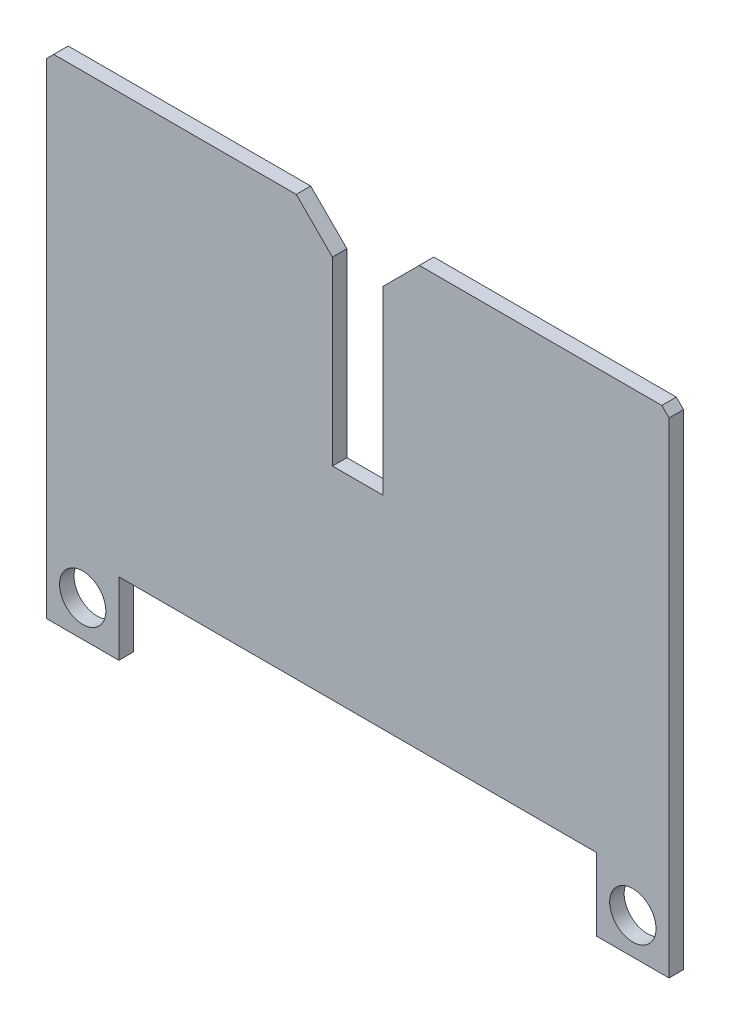
ISO-10303-21;
HEADER;
FILE_DESCRIPTION(('STEP AP214'),'2;1');
FILE_NAME('part.step','',(''),(''),'','','');
FILE_SCHEMA(('AUTOMOTIVE_DESIGN { 1 0 10303 214 1 1 1 1 }'));
ENDSEC;
DATA;
#1=APPLICATION_CONTEXT('core data for automotive mechanical design processes');
#2=APPLICATION_PROTOCOL_DEFINITION('international standard','automotive_design',2000,#1);
#3=PRODUCT_CONTEXT('',#1,'mechanical');
#4=PRODUCT('Part','Part','',(#3));
#5=PRODUCT_RELATED_PRODUCT_CATEGORY('part','',(#4));
#6=PRODUCT_DEFINITION_FORMATION('','',#4);
#7=PRODUCT_DEFINITION_CONTEXT('part definition',#1,'design');
#8=PRODUCT_DEFINITION('design','',#6,#7);
#9=PRODUCT_DEFINITION_SHAPE('','',#8);
#10=(LENGTH_UNIT() NAMED_UNIT(*) SI_UNIT(.MILLI.,.METRE.));
#11=(NAMED_UNIT(*) PLANE_ANGLE_UNIT() SI_UNIT($,.RADIAN.));
#12=(NAMED_UNIT(*) SI_UNIT($,.STERADIAN.) SOLID_ANGLE_UNIT());
#13=UNCERTAINTY_MEASURE_WITH_UNIT(LENGTH_MEASURE(1.E-05),#10,'distance_accuracy_value','');
#14=(GEOMETRIC_REPRESENTATION_CONTEXT(3) GLOBAL_UNCERTAINTY_ASSIGNED_CONTEXT((#13)) GLOBAL_UNIT_ASSIGNED_CONTEXT((#10,
#11,#12)) REPRESENTATION_CONTEXT('',''));
#15=CARTESIAN_POINT('',(0.,0.,0.));
#16=DIRECTION('',(0.,0.,1.));
#17=DIRECTION('',(1.,0.,0.));
#18=AXIS2_PLACEMENT_3D('',#15,#16,#17);
#19=CARTESIAN_POINT('',(-21.5,0.,1.));
#20=DIRECTION('',(-1.,0.,0.));
#21=DIRECTION('',(0.,-1.,0.));
#22=AXIS2_PLACEMENT_3D('',#19,#20,#21);
#23=PLANE('',#22);
#24=DIRECTION('',(0.,1.,0.));
#25=VECTOR('',#24,1.);
#26=CARTESIAN_POINT('',(-21.5,0.,0.));
#27=LINE('',#26,#25);
#28=CARTESIAN_POINT('',(-21.5,-26.475,0.));
#29=VERTEX_POINT('',#28);
#30=CARTESIAN_POINT('',(-21.5,7.025,0.));
#31=VERTEX_POINT('',#30);
#32=EDGE_CURVE('E184',#29,#31,#27,.T.);
#33=ORIENTED_EDGE('',*,*,#32,.F.);
#34=DIRECTION('',(0.,0.,-1.));
#35=VECTOR('',#34,1.);
#36=CARTESIAN_POINT('',(-21.5,-26.475,1.));
#37=LINE('',#36,#35);
#38=CARTESIAN_POINT('',(-21.5,-26.475,1.));
#39=VERTEX_POINT('',#38);
#40=EDGE_CURVE('E11',#39,#29,#37,.T.);
#41=ORIENTED_EDGE('',*,*,#40,.F.);
#42=DIRECTION('',(0.,1.,0.));
#43=VECTOR('',#42,1.);
#44=CARTESIAN_POINT('',(-21.5,0.,1.));
#45=LINE('',#44,#43);
#46=CARTESIAN_POINT('',(-21.5,7.025,1.));
#47=VERTEX_POINT('',#46);
#48=EDGE_CURVE('E232',#39,#47,#45,.T.);
#49=ORIENTED_EDGE('',*,*,#48,.T.);
#50=DIRECTION('',(0.,0.,-1.));
#51=VECTOR('',#50,1.);
#52=CARTESIAN_POINT('',(-21.5,7.025,1.));
#53=LINE('',#52,#51);
#54=EDGE_CURVE('E51',#47,#31,#53,.T.);
#55=ORIENTED_EDGE('',*,*,#54,.T.);
#56=EDGE_LOOP('',(#33,#41,#49,#55));
#57=FACE_BOUND('',#56,.T.);
#58=ADVANCED_FACE('F35',(#57),#23,.T.);
#59=CARTESIAN_POINT('',(0.,-26.475,1.));
#60=DIRECTION('',(0.,1.,0.));
#61=DIRECTION('',(0.,0.,1.));
#62=AXIS2_PLACEMENT_3D('',#59,#60,#61);
#63=PLANE('',#62);
#64=DIRECTION('',(1.,0.,0.));
#65=VECTOR('',#64,1.);
#66=CARTESIAN_POINT('',(0.,-26.475,0.));
#67=LINE('',#66,#65);
#68=CARTESIAN_POINT('',(-16.5,-26.475,0.));
#69=VERTEX_POINT('',#68);
#70=EDGE_CURVE('E186',#29,#69,#67,.T.);
#71=ORIENTED_EDGE('',*,*,#70,.T.);
#72=DIRECTION('',(0.,0.,-1.));
#73=VECTOR('',#72,1.);
#74=CARTESIAN_POINT('',(-16.5,-26.475,1.));
#75=LINE('',#74,#73);
#76=CARTESIAN_POINT('',(-16.5,-26.475,1.));
#77=VERTEX_POINT('',#76);
#78=EDGE_CURVE('E43',#77,#69,#75,.T.);
#79=ORIENTED_EDGE('',*,*,#78,.F.);
#80=DIRECTION('',(1.,0.,0.));
#81=VECTOR('',#80,1.);
#82=CARTESIAN_POINT('',(0.,-26.475,1.));
#83=LINE('',#82,#81);
#84=EDGE_CURVE('E282',#39,#77,#83,.T.);
#85=ORIENTED_EDGE('',*,*,#84,.F.);
#86=ORIENTED_EDGE('',*,*,#40,.T.);
#87=EDGE_LOOP('',(#71,#79,#85,#86));
#88=FACE_BOUND('',#87,.T.);
#89=ADVANCED_FACE('F322',(#88),#63,.F.);
#90=CARTESIAN_POINT('',(-16.5,0.,1.));
#91=DIRECTION('',(-1.,0.,0.));
#92=DIRECTION('',(0.,0.,1.));
#93=AXIS2_PLACEMENT_3D('',#90,#91,#92);
#94=PLANE('',#93);
#95=DIRECTION('',(0.,1.,0.));
#96=VECTOR('',#95,1.);
#97=CARTESIAN_POINT('',(-16.5,0.,0.));
#98=LINE('',#97,#96);
#99=CARTESIAN_POINT('',(-16.5,-21.475,0.));
#100=VERTEX_POINT('',#99);
#101=EDGE_CURVE('E188',#69,#100,#98,.T.);
#102=ORIENTED_EDGE('',*,*,#101,.T.);
#103=DIRECTION('',(0.,0.,-1.));
#104=VECTOR('',#103,1.);
#105=CARTESIAN_POINT('',(-16.5,-21.475,1.));
#106=LINE('',#105,#104);
#107=CARTESIAN_POINT('',(-16.5,-21.475,1.));
#108=VERTEX_POINT('',#107);
#109=EDGE_CURVE('E254',#108,#100,#106,.T.);
#110=ORIENTED_EDGE('',*,*,#109,.F.);
#111=DIRECTION('',(0.,1.,0.));
#112=VECTOR('',#111,1.);
#113=CARTESIAN_POINT('',(-16.5,0.,1.));
#114=LINE('',#113,#112);
#115=EDGE_CURVE('E263',#77,#108,#114,.T.);
#116=ORIENTED_EDGE('',*,*,#115,.F.);
#117=ORIENTED_EDGE('',*,*,#78,.T.);
#118=EDGE_LOOP('',(#102,#110,#116,#117));
#119=FACE_BOUND('',#118,.T.);
#120=ADVANCED_FACE('F261',(#119),#94,.F.);
#121=CARTESIAN_POINT('',(0.,-21.475,1.));
#122=DIRECTION('',(0.,1.,0.));
#123=DIRECTION('',(-1.,0.,0.));
#124=AXIS2_PLACEMENT_3D('',#121,#122,#123);
#125=PLANE('',#124);
#126=DIRECTION('',(1.,0.,0.));
#127=VECTOR('',#126,1.);
#128=CARTESIAN_POINT('',(0.,-21.475,0.));
#129=LINE('',#128,#127);
#130=CARTESIAN_POINT('',(16.5,-21.475,0.));
#131=VERTEX_POINT('',#130);
#132=EDGE_CURVE('E190',#100,#131,#129,.T.);
#133=ORIENTED_EDGE('',*,*,#132,.T.);
#134=DIRECTION('',(0.,0.,-1.));
#135=VECTOR('',#134,1.);
#136=CARTESIAN_POINT('',(16.5,-21.475,1.));
#137=LINE('',#136,#135);
#138=CARTESIAN_POINT('',(16.5,-21.475,1.));
#139=VERTEX_POINT('',#138);
#140=EDGE_CURVE('E252',#139,#131,#137,.T.);
#141=ORIENTED_EDGE('',*,*,#140,.F.);
#142=DIRECTION('',(1.,0.,0.));
#143=VECTOR('',#142,1.);
#144=CARTESIAN_POINT('',(0.,-21.475,1.));
#145=LINE('',#144,#143);
#146=EDGE_CURVE('E276',#108,#139,#145,.T.);
#147=ORIENTED_EDGE('',*,*,#146,.F.);
#148=ORIENTED_EDGE('',*,*,#109,.T.);
#149=EDGE_LOOP('',(#133,#141,#147,#148));
#150=FACE_BOUND('',#149,.T.);
#151=ADVANCED_FACE('F273',(#150),#125,.F.);
#152=CARTESIAN_POINT('',(16.5,0.,1.));
#153=DIRECTION('',(-1.,0.,0.));
#154=DIRECTION('',(0.,0.,1.));
#155=AXIS2_PLACEMENT_3D('',#152,#153,#154);
#156=PLANE('',#155);
#157=DIRECTION('',(0.,1.,0.));
#158=VECTOR('',#157,1.);
#159=CARTESIAN_POINT('',(16.5,0.,0.));
#160=LINE('',#159,#158);
#161=CARTESIAN_POINT('',(16.5,-26.475,0.));
#162=VERTEX_POINT('',#161);
#163=EDGE_CURVE('E193',#162,#131,#160,.T.);
#164=ORIENTED_EDGE('',*,*,#163,.F.);
#165=DIRECTION('',(0.,0.,-1.));
#166=VECTOR('',#165,1.);
#167=CARTESIAN_POINT('',(16.5,-26.475,1.));
#168=LINE('',#167,#166);
#169=CARTESIAN_POINT('',(16.5,-26.475,1.));
#170=VERTEX_POINT('',#169);
#171=EDGE_CURVE('E250',#170,#162,#168,.T.);
#172=ORIENTED_EDGE('',*,*,#171,.F.);
#173=DIRECTION('',(0.,1.,0.));
#174=VECTOR('',#173,1.);
#175=CARTESIAN_POINT('',(16.5,0.,1.));
#176=LINE('',#175,#174);
#177=EDGE_CURVE('E278',#170,#139,#176,.T.);
#178=ORIENTED_EDGE('',*,*,#177,.T.);
#179=ORIENTED_EDGE('',*,*,#140,.T.);
#180=EDGE_LOOP('',(#164,#172,#178,#179));
#181=FACE_BOUND('',#180,.T.);
#182=ADVANCED_FACE('F333',(#181),#156,.T.);
#183=CARTESIAN_POINT('',(0.,-26.475,1.));
#184=DIRECTION('',(0.,-1.,0.));
#185=DIRECTION('',(0.,0.,-1.));
#186=AXIS2_PLACEMENT_3D('',#183,#184,#185);
#187=PLANE('',#186);
#188=DIRECTION('',(-1.,0.,0.));
#189=VECTOR('',#188,1.);
#190=CARTESIAN_POINT('',(0.,-26.475,0.));
#191=LINE('',#190,#189);
#192=CARTESIAN_POINT('',(21.5,-26.475,0.));
#193=VERTEX_POINT('',#192);
#194=EDGE_CURVE('E196',#193,#162,#191,.T.);
#195=ORIENTED_EDGE('',*,*,#194,.F.);
#196=DIRECTION('',(0.,0.,-1.));
#197=VECTOR('',#196,1.);
#198=CARTESIAN_POINT('',(21.5,-26.475,1.));
#199=LINE('',#198,#197);
#200=CARTESIAN_POINT('',(21.5,-26.475,1.));
#201=VERTEX_POINT('',#200);
#202=EDGE_CURVE('E248',#201,#193,#199,.T.);
#203=ORIENTED_EDGE('',*,*,#202,.F.);
#204=DIRECTION('',(-1.,0.,0.));
#205=VECTOR('',#204,1.);
#206=CARTESIAN_POINT('',(0.,-26.475,1.));
#207=LINE('',#206,#205);
#208=EDGE_CURVE('E280',#201,#170,#207,.T.);
#209=ORIENTED_EDGE('',*,*,#208,.T.);
#210=ORIENTED_EDGE('',*,*,#171,.T.);
#211=EDGE_LOOP('',(#195,#203,#209,#210));
#212=FACE_BOUND('',#211,.T.);
#213=ADVANCED_FACE('F336',(#212),#187,.T.);
#214=CARTESIAN_POINT('',(21.5,0.,1.));
#215=DIRECTION('',(-1.,0.,0.));
#216=DIRECTION('',(0.,0.,1.));
#217=AXIS2_PLACEMENT_3D('',#214,#215,#216);
#218=PLANE('',#217);
#219=DIRECTION('',(0.,1.,0.));
#220=VECTOR('',#219,1.);
#221=CARTESIAN_POINT('',(21.5,0.,0.));
#222=LINE('',#221,#220);
#223=CARTESIAN_POINT('',(21.5,7.025,0.));
#224=VERTEX_POINT('',#223);
#225=EDGE_CURVE('E199',#193,#224,#222,.T.);
#226=ORIENTED_EDGE('',*,*,#225,.T.);
#227=DIRECTION('',(0.,0.,-1.));
#228=VECTOR('',#227,1.);
#229=CARTESIAN_POINT('',(21.5,7.025,1.));
#230=LINE('',#229,#228);
#231=CARTESIAN_POINT('',(21.5,7.025,1.));
#232=VERTEX_POINT('',#231);
#233=EDGE_CURVE('E246',#232,#224,#230,.T.);
#234=ORIENTED_EDGE('',*,*,#233,.F.);
#235=DIRECTION('',(0.,1.,0.));
#236=VECTOR('',#235,1.);
#237=CARTESIAN_POINT('',(21.5,0.,1.));
#238=LINE('',#237,#236);
#239=EDGE_CURVE('E288',#201,#232,#238,.T.);
#240=ORIENTED_EDGE('',*,*,#239,.F.);
#241=ORIENTED_EDGE('',*,*,#202,.T.);
#242=EDGE_LOOP('',(#226,#234,#240,#241));
#243=FACE_BOUND('',#242,.T.);
#244=ADVANCED_FACE('F340',(#243),#218,.F.);
#245=CARTESIAN_POINT('',(14.2624999999997,14.2625000000001,1.));
#246=DIRECTION('',(0.707106781186539,0.707106781186556,0.));
#247=DIRECTION('',(-0.707106781186556,0.707106781186539,0.));
#248=AXIS2_PLACEMENT_3D('',#245,#246,#247);
#249=PLANE('',#248);
#250=DIRECTION('',(0.707106781186556,-0.707106781186539,0.));
#251=VECTOR('',#250,1.);
#252=CARTESIAN_POINT('',(14.2624999999997,14.2625000000001,0.));
#253=LINE('',#252,#251);
#254=CARTESIAN_POINT('',(21.,7.525,0.));
#255=VERTEX_POINT('',#254);
#256=EDGE_CURVE('E202',#255,#224,#253,.T.);
#257=ORIENTED_EDGE('',*,*,#256,.F.);
#258=DIRECTION('',(0.,0.,-1.));
#259=VECTOR('',#258,1.);
#260=CARTESIAN_POINT('',(21.,7.525,1.));
#261=LINE('',#260,#259);
#262=CARTESIAN_POINT('',(21.,7.525,1.));
#263=VERTEX_POINT('',#262);
#264=EDGE_CURVE('E244',#263,#255,#261,.T.);
#265=ORIENTED_EDGE('',*,*,#264,.F.);
#266=DIRECTION('',(0.707106781186556,-0.707106781186539,0.));
#267=VECTOR('',#266,1.);
#268=CARTESIAN_POINT('',(14.2624999999997,14.2625000000001,1.));
#269=LINE('',#268,#267);
#270=EDGE_CURVE('E290',#263,#232,#269,.T.);
#271=ORIENTED_EDGE('',*,*,#270,.T.);
#272=ORIENTED_EDGE('',*,*,#233,.T.);
#273=EDGE_LOOP('',(#257,#265,#271,#272));
#274=FACE_BOUND('',#273,.T.);
#275=ADVANCED_FACE('F344',(#274),#249,.T.);
#276=CARTESIAN_POINT('',(0.,7.525,1.));
#277=DIRECTION('',(0.,1.,0.));
#278=DIRECTION('',(0.,0.,1.));
#279=AXIS2_PLACEMENT_3D('',#276,#277,#278);
#280=PLANE('',#279);
#281=DIRECTION('',(1.,0.,0.));
#282=VECTOR('',#281,1.);
#283=CARTESIAN_POINT('',(0.,7.525,0.));
#284=LINE('',#283,#282);
#285=CARTESIAN_POINT('',(4.25,7.525,0.));
#286=VERTEX_POINT('',#285);
#287=EDGE_CURVE('E205',#286,#255,#284,.T.);
#288=ORIENTED_EDGE('',*,*,#287,.F.);
#289=DIRECTION('',(0.,0.,-1.));
#290=VECTOR('',#289,1.);
#291=CARTESIAN_POINT('',(4.25,7.525,1.));
#292=LINE('',#291,#290);
#293=CARTESIAN_POINT('',(4.25,7.525,1.));
#294=VERTEX_POINT('',#293);
#295=EDGE_CURVE('E242',#294,#286,#292,.T.);
#296=ORIENTED_EDGE('',*,*,#295,.F.);
#297=DIRECTION('',(1.,0.,0.));
#298=VECTOR('',#297,1.);
#299=CARTESIAN_POINT('',(0.,7.525,1.));
#300=LINE('',#299,#298);
#301=EDGE_CURVE('E293',#294,#263,#300,.T.);
#302=ORIENTED_EDGE('',*,*,#301,.T.);
#303=ORIENTED_EDGE('',*,*,#264,.T.);
#304=EDGE_LOOP('',(#288,#296,#302,#303));
#305=FACE_BOUND('',#304,.T.);
#306=ADVANCED_FACE('F348',(#305),#280,.T.);
#307=CARTESIAN_POINT('',(-1.6375,1.6375,1.));
#308=DIRECTION('',(-0.707106781186547,0.707106781186548,0.));
#309=DIRECTION('',(-0.707106781186548,-0.707106781186547,0.));
#310=AXIS2_PLACEMENT_3D('',#307,#308,#309);
#311=PLANE('',#310);
#312=DIRECTION('',(0.707106781186548,0.707106781186547,0.));
#313=VECTOR('',#312,1.);
#314=CARTESIAN_POINT('',(-1.6375,1.6375,0.));
#315=LINE('',#314,#313);
#316=CARTESIAN_POINT('',(1.75,5.025,0.));
#317=VERTEX_POINT('',#316);
#318=EDGE_CURVE('E208',#317,#286,#315,.T.);
#319=ORIENTED_EDGE('',*,*,#318,.F.);
#320=DIRECTION('',(0.,0.,-1.));
#321=VECTOR('',#320,1.);
#322=CARTESIAN_POINT('',(1.75,5.025,1.));
#323=LINE('',#322,#321);
#324=CARTESIAN_POINT('',(1.75,5.025,1.));
#325=VERTEX_POINT('',#324);
#326=EDGE_CURVE('E240',#325,#317,#323,.T.);
#327=ORIENTED_EDGE('',*,*,#326,.F.);
#328=DIRECTION('',(0.707106781186548,0.707106781186547,0.));
#329=VECTOR('',#328,1.);
#330=CARTESIAN_POINT('',(-1.6375,1.6375,1.));
#331=LINE('',#330,#329);
#332=EDGE_CURVE('E296',#325,#294,#331,.T.);
#333=ORIENTED_EDGE('',*,*,#332,.T.);
#334=ORIENTED_EDGE('',*,*,#295,.T.);
#335=EDGE_LOOP('',(#319,#327,#333,#334));
#336=FACE_BOUND('',#335,.T.);
#337=ADVANCED_FACE('F352',(#336),#311,.T.);
#338=CARTESIAN_POINT('',(1.75,0.,1.));
#339=DIRECTION('',(1.,0.,0.));
#340=DIRECTION('',(0.,1.,0.));
#341=AXIS2_PLACEMENT_3D('',#338,#339,#340);
#342=PLANE('',#341);
#343=DIRECTION('',(0.,-1.,0.));
#344=VECTOR('',#343,1.);
#345=CARTESIAN_POINT('',(1.75,0.,0.));
#346=LINE('',#345,#344);
#347=CARTESIAN_POINT('',(1.75,-7.475,0.));
#348=VERTEX_POINT('',#347);
#349=EDGE_CURVE('E211',#317,#348,#346,.T.);
#350=ORIENTED_EDGE('',*,*,#349,.T.);
#351=DIRECTION('',(0.,0.,-1.));
#352=VECTOR('',#351,1.);
#353=CARTESIAN_POINT('',(1.75,-7.475,1.));
#354=LINE('',#353,#352);
#355=CARTESIAN_POINT('',(1.75,-7.475,1.));
#356=VERTEX_POINT('',#355);
#357=EDGE_CURVE('E238',#356,#348,#354,.T.);
#358=ORIENTED_EDGE('',*,*,#357,.F.);
#359=DIRECTION('',(0.,-1.,0.));
#360=VECTOR('',#359,1.);
#361=CARTESIAN_POINT('',(1.75,0.,1.));
#362=LINE('',#361,#360);
#363=EDGE_CURVE('E299',#325,#356,#362,.T.);
#364=ORIENTED_EDGE('',*,*,#363,.F.);
#365=ORIENTED_EDGE('',*,*,#326,.T.);
#366=EDGE_LOOP('',(#350,#358,#364,#365));
#367=FACE_BOUND('',#366,.T.);
#368=ADVANCED_FACE('F356',(#367),#342,.F.);
#369=CARTESIAN_POINT('',(0.,-7.475,1.));
#370=DIRECTION('',(0.,1.,0.));
#371=DIRECTION('',(0.,0.,1.));
#372=AXIS2_PLACEMENT_3D('',#369,#370,#371);
#373=PLANE('',#372);
#374=DIRECTION('',(1.,0.,0.));
#375=VECTOR('',#374,1.);
#376=CARTESIAN_POINT('',(0.,-7.475,0.));
#377=LINE('',#376,#375);
#378=CARTESIAN_POINT('',(-1.75,-7.475,0.));
#379=VERTEX_POINT('',#378);
#380=EDGE_CURVE('E214',#379,#348,#377,.T.);
#381=ORIENTED_EDGE('',*,*,#380,.F.);
#382=DIRECTION('',(0.,0.,-1.));
#383=VECTOR('',#382,1.);
#384=CARTESIAN_POINT('',(-1.75,-7.475,1.));
#385=LINE('',#384,#383);
#386=CARTESIAN_POINT('',(-1.75,-7.475,1.));
#387=VERTEX_POINT('',#386);
#388=EDGE_CURVE('E236',#387,#379,#385,.T.);
#389=ORIENTED_EDGE('',*,*,#388,.F.);
#390=DIRECTION('',(1.,0.,0.));
#391=VECTOR('',#390,1.);
#392=CARTESIAN_POINT('',(0.,-7.475,1.));
#393=LINE('',#392,#391);
#394=EDGE_CURVE('E301',#387,#356,#393,.T.);
#395=ORIENTED_EDGE('',*,*,#394,.T.);
#396=ORIENTED_EDGE('',*,*,#357,.T.);
#397=EDGE_LOOP('',(#381,#389,#395,#396));
#398=FACE_BOUND('',#397,.T.);
#399=ADVANCED_FACE('F360',(#398),#373,.T.);
#400=CARTESIAN_POINT('',(-1.75,0.,1.));
#401=DIRECTION('',(1.,0.,0.));
#402=DIRECTION('',(0.,1.,0.));
#403=AXIS2_PLACEMENT_3D('',#400,#401,#402);
#404=PLANE('',#403);
#405=DIRECTION('',(0.,-1.,0.));
#406=VECTOR('',#405,1.);
#407=CARTESIAN_POINT('',(-1.75,0.,0.));
#408=LINE('',#407,#406);
#409=CARTESIAN_POINT('',(-1.75,5.025,0.));
#410=VERTEX_POINT('',#409);
#411=EDGE_CURVE('E217',#410,#379,#408,.T.);
#412=ORIENTED_EDGE('',*,*,#411,.F.);
#413=DIRECTION('',(0.,0.,-1.));
#414=VECTOR('',#413,1.);
#415=CARTESIAN_POINT('',(-1.75,5.025,1.));
#416=LINE('',#415,#414);
#417=CARTESIAN_POINT('',(-1.75,5.025,1.));
#418=VERTEX_POINT('',#417);
#419=EDGE_CURVE('E158',#418,#410,#416,.T.);
#420=ORIENTED_EDGE('',*,*,#419,.F.);
#421=DIRECTION('',(0.,-1.,0.));
#422=VECTOR('',#421,1.);
#423=CARTESIAN_POINT('',(-1.75,0.,1.));
#424=LINE('',#423,#422);
#425=EDGE_CURVE('E170',#418,#387,#424,.T.);
#426=ORIENTED_EDGE('',*,*,#425,.T.);
#427=ORIENTED_EDGE('',*,*,#388,.T.);
#428=EDGE_LOOP('',(#412,#420,#426,#427));
#429=FACE_BOUND('',#428,.T.);
#430=ADVANCED_FACE('F305',(#429),#404,.T.);
#431=CARTESIAN_POINT('',(1.6375,1.6375,1.));
#432=DIRECTION('',(0.707106781186547,0.707106781186547,0.));
#433=DIRECTION('',(-0.707106781186548,0.707106781186548,0.));
#434=AXIS2_PLACEMENT_3D('',#431,#432,#433);
#435=PLANE('',#434);
#436=DIRECTION('',(0.707106781186548,-0.707106781186548,0.));
#437=VECTOR('',#436,1.);
#438=CARTESIAN_POINT('',(1.6375,1.6375,0.));
#439=LINE('',#438,#437);
#440=CARTESIAN_POINT('',(-4.25,7.525,0.));
#441=VERTEX_POINT('',#440);
#442=EDGE_CURVE('E154',#441,#410,#439,.T.);
#443=ORIENTED_EDGE('',*,*,#442,.F.);
#444=DIRECTION('',(0.,0.,-1.));
#445=VECTOR('',#444,1.);
#446=CARTESIAN_POINT('',(-4.25,7.525,1.));
#447=LINE('',#446,#445);
#448=CARTESIAN_POINT('',(-4.25,7.525,1.));
#449=VERTEX_POINT('',#448);
#450=EDGE_CURVE('E149',#449,#441,#447,.T.);
#451=ORIENTED_EDGE('',*,*,#450,.F.);
#452=DIRECTION('',(0.707106781186548,-0.707106781186548,0.));
#453=VECTOR('',#452,1.);
#454=CARTESIAN_POINT('',(1.6375,1.6375,1.));
#455=LINE('',#454,#453);
#456=EDGE_CURVE('E152',#449,#418,#455,.T.);
#457=ORIENTED_EDGE('',*,*,#456,.T.);
#458=ORIENTED_EDGE('',*,*,#419,.T.);
#459=EDGE_LOOP('',(#443,#451,#457,#458));
#460=FACE_BOUND('',#459,.T.);
#461=ADVANCED_FACE('F151',(#460),#435,.T.);
#462=CARTESIAN_POINT('',(0.,7.525,1.));
#463=DIRECTION('',(0.,1.,0.));
#464=DIRECTION('',(0.,0.,1.));
#465=AXIS2_PLACEMENT_3D('',#462,#463,#464);
#466=PLANE('',#465);
#467=DIRECTION('',(1.,0.,0.));
#468=VECTOR('',#467,1.);
#469=CARTESIAN_POINT('',(0.,7.525,0.));
#470=LINE('',#469,#468);
#471=CARTESIAN_POINT('',(-21.,7.525,0.));
#472=VERTEX_POINT('',#471);
#473=EDGE_CURVE('E221',#472,#441,#470,.T.);
#474=ORIENTED_EDGE('',*,*,#473,.F.);
#475=DIRECTION('',(0.,0.,-1.));
#476=VECTOR('',#475,1.);
#477=CARTESIAN_POINT('',(-21.,7.525,1.));
#478=LINE('',#477,#476);
#479=CARTESIAN_POINT('',(-21.,7.525,1.));
#480=VERTEX_POINT('',#479);
#481=EDGE_CURVE('E100',#480,#472,#478,.T.);
#482=ORIENTED_EDGE('',*,*,#481,.F.);
#483=DIRECTION('',(1.,0.,0.));
#484=VECTOR('',#483,1.);
#485=CARTESIAN_POINT('',(0.,7.525,1.));
#486=LINE('',#485,#484);
#487=EDGE_CURVE('E167',#480,#449,#486,.T.);
#488=ORIENTED_EDGE('',*,*,#487,.T.);
#489=ORIENTED_EDGE('',*,*,#450,.T.);
#490=EDGE_LOOP('',(#474,#482,#488,#489));
#491=FACE_BOUND('',#490,.T.);
#492=ADVANCED_FACE('F172',(#491),#466,.T.);
#493=CARTESIAN_POINT('',(19.,-23.975,1.));
#494=DIRECTION('',(0.,0.,-1.));
#495=DIRECTION('',(-1.,0.,0.));
#496=AXIS2_PLACEMENT_3D('',#493,#494,#495);
#497=CYLINDRICAL_SURFACE('',#496,1.6);
#498=CARTESIAN_POINT('',(19.,-23.975,1.));
#499=DIRECTION('',(0.,0.,1.));
#500=DIRECTION('',(1.,0.,0.));
#501=AXIS2_PLACEMENT_3D('',#498,#499,#500);
#502=CIRCLE('',#501,1.6);
#503=CARTESIAN_POINT('',(20.6,-23.975,1.));
#504=VERTEX_POINT('',#503);
#505=EDGE_CURVE('E175',#504,#504,#502,.F.);
#506=ORIENTED_EDGE('',*,*,#505,.F.);
#507=EDGE_LOOP('',(#506));
#508=FACE_BOUND('',#507,.T.);
#509=CARTESIAN_POINT('',(19.,-23.975,0.));
#510=DIRECTION('',(0.,0.,1.));
#511=DIRECTION('',(1.,0.,0.));
#512=AXIS2_PLACEMENT_3D('',#509,#510,#511);
#513=CIRCLE('',#512,1.6);
#514=CARTESIAN_POINT('',(20.6,-23.975,0.));
#515=VERTEX_POINT('',#514);
#516=EDGE_CURVE('E226',#515,#515,#513,.F.);
#517=ORIENTED_EDGE('',*,*,#516,.T.);
#518=EDGE_LOOP('',(#517));
#519=FACE_BOUND('',#518,.T.);
#520=ADVANCED_FACE('F310',(#508,#519),#497,.F.);
#521=CARTESIAN_POINT('',(-14.2625,14.2625,1.));
#522=DIRECTION('',(-0.707106781186547,0.707106781186547,0.));
#523=DIRECTION('',(-0.707106781186548,-0.707106781186548,0.));
#524=AXIS2_PLACEMENT_3D('',#521,#522,#523);
#525=PLANE('',#524);
#526=DIRECTION('',(0.707106781186548,0.707106781186548,0.));
#527=VECTOR('',#526,1.);
#528=CARTESIAN_POINT('',(-14.2625,14.2625,0.));
#529=LINE('',#528,#527);
#530=EDGE_CURVE('E223',#31,#472,#529,.T.);
#531=ORIENTED_EDGE('',*,*,#530,.F.);
#532=ORIENTED_EDGE('',*,*,#54,.F.);
#533=DIRECTION('',(0.707106781186548,0.707106781186548,0.));
#534=VECTOR('',#533,1.);
#535=CARTESIAN_POINT('',(-14.2625,14.2625,1.));
#536=LINE('',#535,#534);
#537=EDGE_CURVE('E173',#47,#480,#536,.T.);
#538=ORIENTED_EDGE('',*,*,#537,.T.);
#539=ORIENTED_EDGE('',*,*,#481,.T.);
#540=EDGE_LOOP('',(#531,#532,#538,#539));
#541=FACE_BOUND('',#540,.T.);
#542=ADVANCED_FACE('F307',(#541),#525,.T.);
#543=CARTESIAN_POINT('',(-19.,-23.975,1.));
#544=DIRECTION('',(0.,0.,-1.));
#545=DIRECTION('',(-1.,0.,0.));
#546=AXIS2_PLACEMENT_3D('',#543,#544,#545);
#547=CYLINDRICAL_SURFACE('',#546,1.6);
#548=CARTESIAN_POINT('',(-19.,-23.975,1.));
#549=DIRECTION('',(0.,0.,1.));
#550=DIRECTION('',(1.,0.,0.));
#551=AXIS2_PLACEMENT_3D('',#548,#549,#550);
#552=CIRCLE('',#551,1.6);
#553=CARTESIAN_POINT('',(-17.4,-23.975,1.));
#554=VERTEX_POINT('',#553);
#555=EDGE_CURVE('E181',#554,#554,#552,.T.);
#556=ORIENTED_EDGE('',*,*,#555,.T.);
#557=EDGE_LOOP('',(#556));
#558=FACE_BOUND('',#557,.T.);
#559=CARTESIAN_POINT('',(-19.,-23.975,0.));
#560=DIRECTION('',(0.,0.,1.));
#561=DIRECTION('',(1.,0.,0.));
#562=AXIS2_PLACEMENT_3D('',#559,#560,#561);
#563=CIRCLE('',#562,1.6);
#564=CARTESIAN_POINT('',(-17.4,-23.975,0.));
#565=VERTEX_POINT('',#564);
#566=EDGE_CURVE('E229',#565,#565,#563,.T.);
#567=ORIENTED_EDGE('',*,*,#566,.F.);
#568=EDGE_LOOP('',(#567));
#569=FACE_BOUND('',#568,.T.);
#570=ADVANCED_FACE('F309',(#558,#569),#547,.F.);
#571=CARTESIAN_POINT('',(0.,0.,1.));
#572=DIRECTION('',(0.,0.,1.));
#573=DIRECTION('',(1.,0.,0.));
#574=AXIS2_PLACEMENT_3D('',#571,#572,#573);
#575=PLANE('',#574);
#576=ORIENTED_EDGE('',*,*,#48,.F.);
#577=ORIENTED_EDGE('',*,*,#84,.T.);
#578=ORIENTED_EDGE('',*,*,#115,.T.);
#579=ORIENTED_EDGE('',*,*,#146,.T.);
#580=ORIENTED_EDGE('',*,*,#177,.F.);
#581=ORIENTED_EDGE('',*,*,#208,.F.);
#582=ORIENTED_EDGE('',*,*,#239,.T.);
#583=ORIENTED_EDGE('',*,*,#270,.F.);
#584=ORIENTED_EDGE('',*,*,#301,.F.);
#585=ORIENTED_EDGE('',*,*,#332,.F.);
#586=ORIENTED_EDGE('',*,*,#363,.T.);
#587=ORIENTED_EDGE('',*,*,#394,.F.);
#588=ORIENTED_EDGE('',*,*,#425,.F.);
#589=ORIENTED_EDGE('',*,*,#456,.F.);
#590=ORIENTED_EDGE('',*,*,#487,.F.);
#591=ORIENTED_EDGE('',*,*,#537,.F.);
#592=EDGE_LOOP('',(#576,#577,#578,#579,#580,#581,#582,#583,#584,#585,#586,#587,#588,#589,#590,#591));
#593=FACE_BOUND('',#592,.T.);
#594=ORIENTED_EDGE('',*,*,#505,.T.);
#595=EDGE_LOOP('',(#594));
#596=FACE_BOUND('',#595,.T.);
#597=ORIENTED_EDGE('',*,*,#555,.F.);
#598=EDGE_LOOP('',(#597));
#599=FACE_BOUND('',#598,.T.);
#600=ADVANCED_FACE('F164',(#593,#596,#599),#575,.T.);
#601=CARTESIAN_POINT('',(0.,0.,0.));
#602=DIRECTION('',(0.,0.,1.));
#603=DIRECTION('',(1.,0.,0.));
#604=AXIS2_PLACEMENT_3D('',#601,#602,#603);
#605=PLANE('',#604);
#606=ORIENTED_EDGE('',*,*,#32,.T.);
#607=ORIENTED_EDGE('',*,*,#530,.T.);
#608=ORIENTED_EDGE('',*,*,#473,.T.);
#609=ORIENTED_EDGE('',*,*,#442,.T.);
#610=ORIENTED_EDGE('',*,*,#411,.T.);
#611=ORIENTED_EDGE('',*,*,#380,.T.);
#612=ORIENTED_EDGE('',*,*,#349,.F.);
#613=ORIENTED_EDGE('',*,*,#318,.T.);
#614=ORIENTED_EDGE('',*,*,#287,.T.);
#615=ORIENTED_EDGE('',*,*,#256,.T.);
#616=ORIENTED_EDGE('',*,*,#225,.F.);
#617=ORIENTED_EDGE('',*,*,#194,.T.);
#618=ORIENTED_EDGE('',*,*,#163,.T.);
#619=ORIENTED_EDGE('',*,*,#132,.F.);
#620=ORIENTED_EDGE('',*,*,#101,.F.);
#621=ORIENTED_EDGE('',*,*,#70,.F.);
#622=EDGE_LOOP('',(#606,#607,#608,#609,#610,#611,#612,#613,#614,#615,#616,#617,#618,#619,#620,#621));
#623=FACE_BOUND('',#622,.T.);
#624=ORIENTED_EDGE('',*,*,#516,.F.);
#625=EDGE_LOOP('',(#624));
#626=FACE_BOUND('',#625,.T.);
#627=ORIENTED_EDGE('',*,*,#566,.T.);
#628=EDGE_LOOP('',(#627));
#629=FACE_BOUND('',#628,.T.);
#630=ADVANCED_FACE('F268',(#623,#626,#629),#605,.F.);
#631=CLOSED_SHELL('',(#58,#89,#120,#151,#182,#213,#244,#275,#306,#337,#368,#399,#430,#461,#492,
#520,#542,#570,#600,#630));
#632=MANIFOLD_SOLID_BREP('B2',#631);
#633=ADVANCED_BREP_SHAPE_REPRESENTATION('',(#18,#632),#14);
#634=SHAPE_DEFINITION_REPRESENTATION(#9,#633);
ENDSEC;
END-ISO-10303-21;
